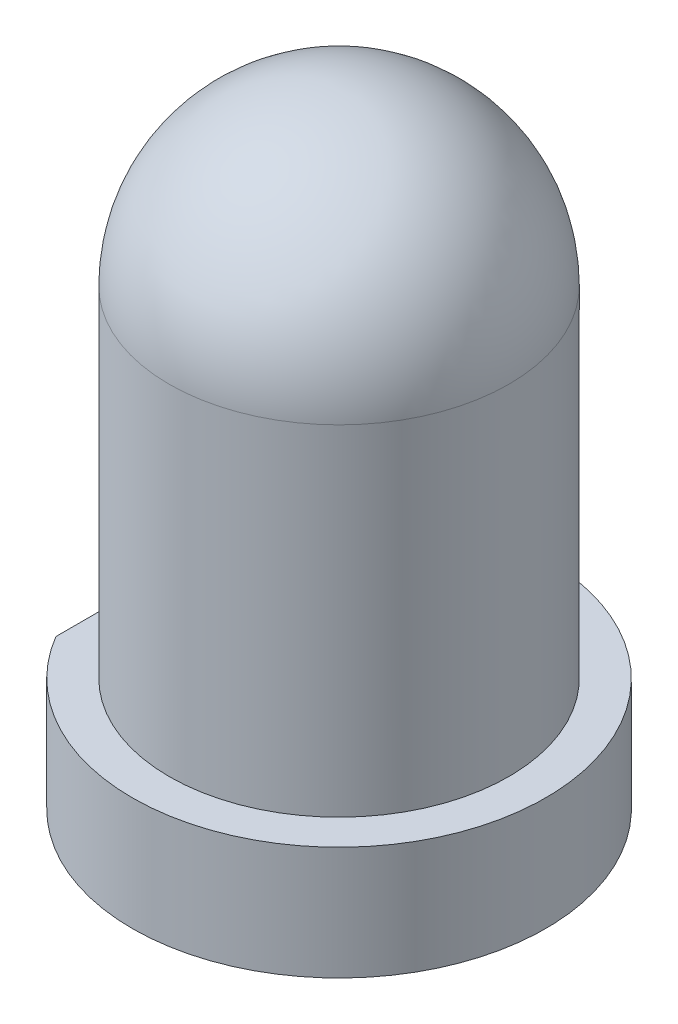
ISO-10303-21;
HEADER;
FILE_DESCRIPTION(('STEP AP214'),'2;1');
FILE_NAME('part.step','',(''),(''),'','','');
FILE_SCHEMA(('AUTOMOTIVE_DESIGN { 1 0 10303 214 1 1 1 1 }'));
ENDSEC;
DATA;
#1=APPLICATION_CONTEXT('core data for automotive mechanical design processes');
#2=APPLICATION_PROTOCOL_DEFINITION('international standard','automotive_design',2000,#1);
#3=PRODUCT_CONTEXT('',#1,'mechanical');
#4=PRODUCT('Part','Part','',(#3));
#5=PRODUCT_RELATED_PRODUCT_CATEGORY('part','',(#4));
#6=PRODUCT_DEFINITION_FORMATION('','',#4);
#7=PRODUCT_DEFINITION_CONTEXT('part definition',#1,'design');
#8=PRODUCT_DEFINITION('design','',#6,#7);
#9=PRODUCT_DEFINITION_SHAPE('','',#8);
#10=(LENGTH_UNIT() NAMED_UNIT(*) SI_UNIT(.MILLI.,.METRE.));
#11=(NAMED_UNIT(*) PLANE_ANGLE_UNIT() SI_UNIT($,.RADIAN.));
#12=(NAMED_UNIT(*) SI_UNIT($,.STERADIAN.) SOLID_ANGLE_UNIT());
#13=UNCERTAINTY_MEASURE_WITH_UNIT(LENGTH_MEASURE(1.E-05),#10,'distance_accuracy_value','');
#14=(GEOMETRIC_REPRESENTATION_CONTEXT(3) GLOBAL_UNCERTAINTY_ASSIGNED_CONTEXT((#13)) GLOBAL_UNIT_ASSIGNED_CONTEXT((#10,
#11,#12)) REPRESENTATION_CONTEXT('',''));
#15=CARTESIAN_POINT('',(0.,0.,0.));
#16=DIRECTION('',(0.,0.,1.));
#17=DIRECTION('',(1.,0.,0.));
#18=AXIS2_PLACEMENT_3D('',#15,#16,#17);
#19=CARTESIAN_POINT('',(0.,0.,0.));
#20=DIRECTION('',(0.,1.,0.));
#21=DIRECTION('',(0.,0.,1.));
#22=AXIS2_PLACEMENT_3D('',#19,#20,#21);
#23=PLANE('',#22);
#24=DIRECTION('',(0.,0.,1.));
#25=VECTOR('',#24,1.);
#26=CARTESIAN_POINT('',(-1.57091917889801,0.,0.));
#27=LINE('',#26,#25);
#28=CARTESIAN_POINT('',(-1.57091917889801,0.,-0.928890700443491));
#29=VERTEX_POINT('',#28);
#30=CARTESIAN_POINT('',(-1.57091917889801,0.,0.928890700443491));
#31=VERTEX_POINT('',#30);
#32=EDGE_CURVE('E53',#29,#31,#27,.T.);
#33=ORIENTED_EDGE('',*,*,#32,.F.);
#34=CARTESIAN_POINT('',(0.,0.,0.));
#35=DIRECTION('',(0.,1.,0.));
#36=DIRECTION('',(0.,0.,1.));
#37=AXIS2_PLACEMENT_3D('',#34,#35,#36);
#38=CIRCLE('',#37,1.825);
#39=EDGE_CURVE('E42',#31,#29,#38,.T.);
#40=ORIENTED_EDGE('',*,*,#39,.F.);
#41=EDGE_LOOP('',(#33,#40));
#42=FACE_BOUND('',#41,.T.);
#43=ADVANCED_FACE('F35',(#42),#23,.F.);
#44=CARTESIAN_POINT('',(0.,5.83124610880428,0.));
#45=DIRECTION('',(0.,1.,0.));
#46=DIRECTION('',(0.,0.,1.));
#47=AXIS2_PLACEMENT_3D('',#44,#45,#46);
#48=CYLINDRICAL_SURFACE('',#47,1.825);
#49=DIRECTION('',(0.,1.,0.));
#50=VECTOR('',#49,1.);
#51=CARTESIAN_POINT('',(-1.57091917889801,5.83124610880428,0.928890700443491));
#52=LINE('',#51,#50);
#53=CARTESIAN_POINT('',(-1.57091917889801,1.,0.928890700443491));
#54=VERTEX_POINT('',#53);
#55=EDGE_CURVE('E48',#31,#54,#52,.T.);
#56=ORIENTED_EDGE('',*,*,#55,.F.);
#57=ORIENTED_EDGE('',*,*,#39,.T.);
#58=DIRECTION('',(0.,1.,0.));
#59=VECTOR('',#58,1.);
#60=CARTESIAN_POINT('',(-1.57091917889801,5.83124610880428,-0.928890700443491));
#61=LINE('',#60,#59);
#62=CARTESIAN_POINT('',(-1.57091917889801,1.,-0.928890700443491));
#63=VERTEX_POINT('',#62);
#64=EDGE_CURVE('E59',#63,#29,#61,.F.);
#65=ORIENTED_EDGE('',*,*,#64,.F.);
#66=CARTESIAN_POINT('',(0.,1.,0.));
#67=DIRECTION('',(0.,1.,0.));
#68=DIRECTION('',(0.,0.,1.));
#69=AXIS2_PLACEMENT_3D('',#66,#67,#68);
#70=CIRCLE('',#69,1.825);
#71=EDGE_CURVE('E66',#54,#63,#70,.T.);
#72=ORIENTED_EDGE('',*,*,#71,.F.);
#73=EDGE_LOOP('',(#56,#57,#65,#72));
#74=FACE_BOUND('',#73,.T.);
#75=ADVANCED_FACE('F65',(#74),#48,.T.);
#76=CARTESIAN_POINT('',(1.825,1.,0.));
#77=DIRECTION('',(0.,-1.,0.));
#78=DIRECTION('',(0.,0.,-1.));
#79=AXIS2_PLACEMENT_3D('',#76,#77,#78);
#80=PLANE('',#79);
#81=CARTESIAN_POINT('',(0.,1.,0.));
#82=DIRECTION('',(0.,1.,0.));
#83=DIRECTION('',(0.,0.,1.));
#84=AXIS2_PLACEMENT_3D('',#81,#82,#83);
#85=CIRCLE('',#84,1.5);
#86=CARTESIAN_POINT('',(0.,1.,1.5));
#87=VERTEX_POINT('',#86);
#88=EDGE_CURVE('E70',#87,#87,#85,.T.);
#89=ORIENTED_EDGE('',*,*,#88,.F.);
#90=EDGE_LOOP('',(#89));
#91=FACE_BOUND('',#90,.T.);
#92=DIRECTION('',(0.,0.,-1.));
#93=VECTOR('',#92,1.);
#94=CARTESIAN_POINT('',(-1.57091917889801,1.,0.));
#95=LINE('',#94,#93);
#96=EDGE_CURVE('E11',#54,#63,#95,.T.);
#97=ORIENTED_EDGE('',*,*,#96,.F.);
#98=ORIENTED_EDGE('',*,*,#71,.T.);
#99=EDGE_LOOP('',(#97,#98));
#100=FACE_BOUND('',#99,.T.);
#101=ADVANCED_FACE('F69',(#91,#100),#80,.F.);
#102=CARTESIAN_POINT('',(0.,5.83124610880428,0.));
#103=DIRECTION('',(0.,1.,0.));
#104=DIRECTION('',(0.,0.,1.));
#105=AXIS2_PLACEMENT_3D('',#102,#103,#104);
#106=CYLINDRICAL_SURFACE('',#105,1.5);
#107=CARTESIAN_POINT('',(0.,4.,0.));
#108=DIRECTION('',(0.,1.,0.));
#109=DIRECTION('',(0.,0.,1.));
#110=AXIS2_PLACEMENT_3D('',#107,#108,#109);
#111=CIRCLE('',#110,1.5);
#112=CARTESIAN_POINT('',(0.,4.,1.5));
#113=VERTEX_POINT('',#112);
#114=EDGE_CURVE('E73',#113,#113,#111,.T.);
#115=ORIENTED_EDGE('',*,*,#114,.F.);
#116=EDGE_LOOP('',(#115));
#117=FACE_BOUND('',#116,.T.);
#118=ORIENTED_EDGE('',*,*,#88,.T.);
#119=EDGE_LOOP('',(#118));
#120=FACE_BOUND('',#119,.T.);
#121=ADVANCED_FACE('F83',(#117,#120),#106,.T.);
#122=CARTESIAN_POINT('',(0.,4.,0.));
#123=DIRECTION('',(0.,1.,0.));
#124=DIRECTION('',(1.,0.,0.));
#125=AXIS2_PLACEMENT_3D('',#122,#123,#124);
#126=SPHERICAL_SURFACE('',#125,1.5);
#127=ORIENTED_EDGE('',*,*,#114,.T.);
#128=EDGE_LOOP('',(#127));
#129=FACE_BOUND('',#128,.T.);
#130=ADVANCED_FACE('F81',(#129),#126,.T.);
#131=CARTESIAN_POINT('',(-1.57091917889801,5.5,-1.38985544236916));
#132=DIRECTION('',(-1.,0.,0.));
#133=DIRECTION('',(0.,0.,1.));
#134=AXIS2_PLACEMENT_3D('',#131,#132,#133);
#135=PLANE('',#134);
#136=ORIENTED_EDGE('',*,*,#32,.T.);
#137=ORIENTED_EDGE('',*,*,#55,.T.);
#138=ORIENTED_EDGE('',*,*,#96,.T.);
#139=ORIENTED_EDGE('',*,*,#64,.T.);
#140=EDGE_LOOP('',(#136,#137,#138,#139));
#141=FACE_BOUND('',#140,.T.);
#142=ADVANCED_FACE('F58',(#141),#135,.T.);
#143=CLOSED_SHELL('',(#43,#75,#101,#121,#130,#142));
#144=MANIFOLD_SOLID_BREP('B2',#143);
#145=ADVANCED_BREP_SHAPE_REPRESENTATION('',(#18,#144),#14);
#146=SHAPE_DEFINITION_REPRESENTATION(#9,#145);
ENDSEC;
END-ISO-10303-21;
